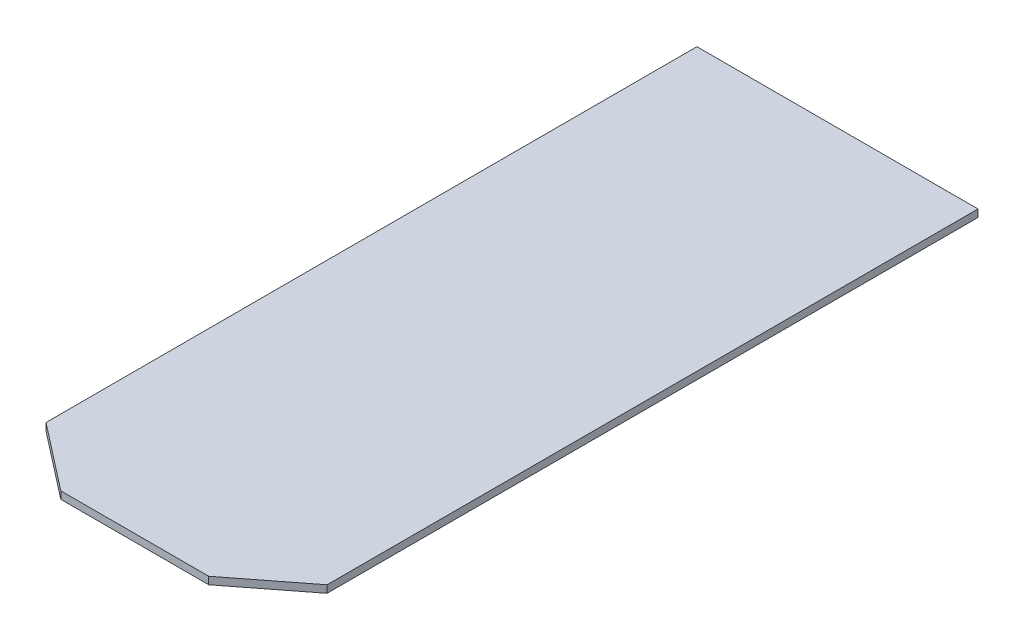
ISO-10303-21;
HEADER;
FILE_DESCRIPTION(('STEP AP214'),'2;1');
FILE_NAME('part.step','',(''),(''),'','','');
FILE_SCHEMA(('AUTOMOTIVE_DESIGN { 1 0 10303 214 1 1 1 1 }'));
ENDSEC;
DATA;
#1=APPLICATION_CONTEXT('core data for automotive mechanical design processes');
#2=APPLICATION_PROTOCOL_DEFINITION('international standard','automotive_design',2000,#1);
#3=PRODUCT_CONTEXT('',#1,'mechanical');
#4=PRODUCT('Part','Part','',(#3));
#5=PRODUCT_RELATED_PRODUCT_CATEGORY('part','',(#4));
#6=PRODUCT_DEFINITION_FORMATION('','',#4);
#7=PRODUCT_DEFINITION_CONTEXT('part definition',#1,'design');
#8=PRODUCT_DEFINITION('design','',#6,#7);
#9=PRODUCT_DEFINITION_SHAPE('','',#8);
#10=(LENGTH_UNIT() NAMED_UNIT(*) SI_UNIT(.MILLI.,.METRE.));
#11=(NAMED_UNIT(*) PLANE_ANGLE_UNIT() SI_UNIT($,.RADIAN.));
#12=(NAMED_UNIT(*) SI_UNIT($,.STERADIAN.) SOLID_ANGLE_UNIT());
#13=UNCERTAINTY_MEASURE_WITH_UNIT(LENGTH_MEASURE(1.E-05),#10,'distance_accuracy_value','');
#14=(GEOMETRIC_REPRESENTATION_CONTEXT(3) GLOBAL_UNCERTAINTY_ASSIGNED_CONTEXT((#13)) GLOBAL_UNIT_ASSIGNED_CONTEXT((#10,
#11,#12)) REPRESENTATION_CONTEXT('',''));
#15=CARTESIAN_POINT('',(0.,0.,0.));
#16=DIRECTION('',(0.,0.,1.));
#17=DIRECTION('',(1.,0.,0.));
#18=AXIS2_PLACEMENT_3D('',#15,#16,#17);
#19=CARTESIAN_POINT('',(19.,1.,-47.5));
#20=DIRECTION('',(-1.,0.,0.));
#21=DIRECTION('',(0.,0.,1.));
#22=AXIS2_PLACEMENT_3D('',#19,#20,#21);
#23=PLANE('',#22);
#24=DIRECTION('',(0.,0.,-1.));
#25=VECTOR('',#24,1.);
#26=CARTESIAN_POINT('',(19.,0.,-47.5));
#27=LINE('',#26,#25);
#28=CARTESIAN_POINT('',(19.,0.,40.5));
#29=VERTEX_POINT('',#28);
#30=CARTESIAN_POINT('',(19.,0.,-47.5));
#31=VERTEX_POINT('',#30);
#32=EDGE_CURVE('E117',#29,#31,#27,.T.);
#33=ORIENTED_EDGE('',*,*,#32,.T.);
#34=DIRECTION('',(0.,-1.,0.));
#35=VECTOR('',#34,1.);
#36=CARTESIAN_POINT('',(19.,1.,-47.5));
#37=LINE('',#36,#35);
#38=CARTESIAN_POINT('',(19.,1.,-47.5));
#39=VERTEX_POINT('',#38);
#40=EDGE_CURVE('E11',#39,#31,#37,.T.);
#41=ORIENTED_EDGE('',*,*,#40,.F.);
#42=DIRECTION('',(0.,0.,-1.));
#43=VECTOR('',#42,1.);
#44=CARTESIAN_POINT('',(19.,1.,-47.5));
#45=LINE('',#44,#43);
#46=CARTESIAN_POINT('',(19.,1.,40.5));
#47=VERTEX_POINT('',#46);
#48=EDGE_CURVE('E127',#47,#39,#45,.T.);
#49=ORIENTED_EDGE('',*,*,#48,.F.);
#50=DIRECTION('',(0.,-1.,0.));
#51=VECTOR('',#50,1.);
#52=CARTESIAN_POINT('',(19.,1.,40.5));
#53=LINE('',#52,#51);
#54=EDGE_CURVE('E113',#47,#29,#53,.T.);
#55=ORIENTED_EDGE('',*,*,#54,.T.);
#56=EDGE_LOOP('',(#33,#41,#49,#55));
#57=FACE_BOUND('',#56,.T.);
#58=ADVANCED_FACE('F33',(#57),#23,.F.);
#59=CARTESIAN_POINT('',(19.,1.,-47.5));
#60=DIRECTION('',(0.,0.,1.));
#61=DIRECTION('',(1.,0.,0.));
#62=AXIS2_PLACEMENT_3D('',#59,#60,#61);
#63=PLANE('',#62);
#64=DIRECTION('',(-1.,0.,0.));
#65=VECTOR('',#64,1.);
#66=CARTESIAN_POINT('',(19.,0.,-47.5));
#67=LINE('',#66,#65);
#68=CARTESIAN_POINT('',(-19.,0.,-47.5));
#69=VERTEX_POINT('',#68);
#70=EDGE_CURVE('E120',#31,#69,#67,.T.);
#71=ORIENTED_EDGE('',*,*,#70,.T.);
#72=DIRECTION('',(0.,-1.,0.));
#73=VECTOR('',#72,1.);
#74=CARTESIAN_POINT('',(-19.,1.,-47.5));
#75=LINE('',#74,#73);
#76=CARTESIAN_POINT('',(-19.,1.,-47.5));
#77=VERTEX_POINT('',#76);
#78=EDGE_CURVE('E41',#77,#69,#75,.T.);
#79=ORIENTED_EDGE('',*,*,#78,.F.);
#80=DIRECTION('',(-1.,0.,0.));
#81=VECTOR('',#80,1.);
#82=CARTESIAN_POINT('',(19.,1.,-47.5));
#83=LINE('',#82,#81);
#84=EDGE_CURVE('E86',#39,#77,#83,.T.);
#85=ORIENTED_EDGE('',*,*,#84,.F.);
#86=ORIENTED_EDGE('',*,*,#40,.T.);
#87=EDGE_LOOP('',(#71,#79,#85,#86));
#88=FACE_BOUND('',#87,.T.);
#89=ADVANCED_FACE('F151',(#88),#63,.F.);
#90=CARTESIAN_POINT('',(-19.,1.,-47.5));
#91=DIRECTION('',(1.,0.,0.));
#92=DIRECTION('',(0.,0.,-1.));
#93=AXIS2_PLACEMENT_3D('',#90,#91,#92);
#94=PLANE('',#93);
#95=DIRECTION('',(0.,0.,1.));
#96=VECTOR('',#95,1.);
#97=CARTESIAN_POINT('',(-19.,0.,-47.5));
#98=LINE('',#97,#96);
#99=CARTESIAN_POINT('',(-19.,0.,40.5));
#100=VERTEX_POINT('',#99);
#101=EDGE_CURVE('E122',#69,#100,#98,.T.);
#102=ORIENTED_EDGE('',*,*,#101,.T.);
#103=DIRECTION('',(0.,-1.,0.));
#104=VECTOR('',#103,1.);
#105=CARTESIAN_POINT('',(-19.,1.,40.5));
#106=LINE('',#105,#104);
#107=CARTESIAN_POINT('',(-19.,1.,40.5));
#108=VERTEX_POINT('',#107);
#109=EDGE_CURVE('E108',#108,#100,#106,.T.);
#110=ORIENTED_EDGE('',*,*,#109,.F.);
#111=DIRECTION('',(0.,0.,1.));
#112=VECTOR('',#111,1.);
#113=CARTESIAN_POINT('',(-19.,1.,-47.5));
#114=LINE('',#113,#112);
#115=EDGE_CURVE('E99',#77,#108,#114,.T.);
#116=ORIENTED_EDGE('',*,*,#115,.F.);
#117=ORIENTED_EDGE('',*,*,#78,.T.);
#118=EDGE_LOOP('',(#102,#110,#116,#117));
#119=FACE_BOUND('',#118,.T.);
#120=ADVANCED_FACE('F133',(#119),#94,.F.);
#121=CARTESIAN_POINT('',(-19.,1.,40.5));
#122=DIRECTION('',(0.613940613514921,0.,-0.789352217376326));
#123=DIRECTION('',(-0.789352217376326,0.,-0.613940613514921));
#124=AXIS2_PLACEMENT_3D('',#121,#122,#123);
#125=PLANE('',#124);
#126=DIRECTION('',(0.789352217376326,0.,0.613940613514921));
#127=VECTOR('',#126,1.);
#128=CARTESIAN_POINT('',(-19.,0.,40.5));
#129=LINE('',#128,#127);
#130=CARTESIAN_POINT('',(-10.,0.,47.5));
#131=VERTEX_POINT('',#130);
#132=EDGE_CURVE('E107',#100,#131,#129,.T.);
#133=ORIENTED_EDGE('',*,*,#132,.T.);
#134=DIRECTION('',(0.,-1.,0.));
#135=VECTOR('',#134,1.);
#136=CARTESIAN_POINT('',(-10.,1.,47.5));
#137=LINE('',#136,#135);
#138=CARTESIAN_POINT('',(-10.,1.,47.5));
#139=VERTEX_POINT('',#138);
#140=EDGE_CURVE('E104',#139,#131,#137,.T.);
#141=ORIENTED_EDGE('',*,*,#140,.F.);
#142=DIRECTION('',(0.789352217376326,0.,0.613940613514921));
#143=VECTOR('',#142,1.);
#144=CARTESIAN_POINT('',(-19.,1.,40.5));
#145=LINE('',#144,#143);
#146=EDGE_CURVE('E93',#108,#139,#145,.T.);
#147=ORIENTED_EDGE('',*,*,#146,.F.);
#148=ORIENTED_EDGE('',*,*,#109,.T.);
#149=EDGE_LOOP('',(#133,#141,#147,#148));
#150=FACE_BOUND('',#149,.T.);
#151=ADVANCED_FACE('F105',(#150),#125,.F.);
#152=CARTESIAN_POINT('',(10.,1.,47.5));
#153=DIRECTION('',(0.,0.,-1.));
#154=DIRECTION('',(-1.,0.,0.));
#155=AXIS2_PLACEMENT_3D('',#152,#153,#154);
#156=PLANE('',#155);
#157=DIRECTION('',(1.,0.,0.));
#158=VECTOR('',#157,1.);
#159=CARTESIAN_POINT('',(10.,0.,47.5));
#160=LINE('',#159,#158);
#161=CARTESIAN_POINT('',(10.,0.,47.5));
#162=VERTEX_POINT('',#161);
#163=EDGE_CURVE('E72',#131,#162,#160,.T.);
#164=ORIENTED_EDGE('',*,*,#163,.T.);
#165=DIRECTION('',(0.,-1.,0.));
#166=VECTOR('',#165,1.);
#167=CARTESIAN_POINT('',(10.,1.,47.5));
#168=LINE('',#167,#166);
#169=CARTESIAN_POINT('',(10.,1.,47.5));
#170=VERTEX_POINT('',#169);
#171=EDGE_CURVE('E109',#170,#162,#168,.T.);
#172=ORIENTED_EDGE('',*,*,#171,.F.);
#173=DIRECTION('',(1.,0.,0.));
#174=VECTOR('',#173,1.);
#175=CARTESIAN_POINT('',(10.,1.,47.5));
#176=LINE('',#175,#174);
#177=EDGE_CURVE('E97',#139,#170,#176,.T.);
#178=ORIENTED_EDGE('',*,*,#177,.F.);
#179=ORIENTED_EDGE('',*,*,#140,.T.);
#180=EDGE_LOOP('',(#164,#172,#178,#179));
#181=FACE_BOUND('',#180,.T.);
#182=ADVANCED_FACE('F111',(#181),#156,.F.);
#183=CARTESIAN_POINT('',(10.,1.,47.5));
#184=DIRECTION('',(-0.613940613514921,0.,-0.789352217376326));
#185=DIRECTION('',(-0.789352217376326,0.,0.613940613514921));
#186=AXIS2_PLACEMENT_3D('',#183,#184,#185);
#187=PLANE('',#186);
#188=DIRECTION('',(0.789352217376326,0.,-0.613940613514921));
#189=VECTOR('',#188,1.);
#190=CARTESIAN_POINT('',(10.,0.,47.5));
#191=LINE('',#190,#189);
#192=EDGE_CURVE('E78',#162,#29,#191,.T.);
#193=ORIENTED_EDGE('',*,*,#192,.T.);
#194=ORIENTED_EDGE('',*,*,#54,.F.);
#195=DIRECTION('',(0.789352217376326,0.,-0.613940613514921));
#196=VECTOR('',#195,1.);
#197=CARTESIAN_POINT('',(10.,1.,47.5));
#198=LINE('',#197,#196);
#199=EDGE_CURVE('E49',#170,#47,#198,.T.);
#200=ORIENTED_EDGE('',*,*,#199,.F.);
#201=ORIENTED_EDGE('',*,*,#171,.T.);
#202=EDGE_LOOP('',(#193,#194,#200,#201));
#203=FACE_BOUND('',#202,.T.);
#204=ADVANCED_FACE('F140',(#203),#187,.F.);
#205=CARTESIAN_POINT('',(0.,1.,0.));
#206=DIRECTION('',(0.,-1.,0.));
#207=DIRECTION('',(0.,0.,-1.));
#208=AXIS2_PLACEMENT_3D('',#205,#206,#207);
#209=PLANE('',#208);
#210=ORIENTED_EDGE('',*,*,#48,.T.);
#211=ORIENTED_EDGE('',*,*,#84,.T.);
#212=ORIENTED_EDGE('',*,*,#115,.T.);
#213=ORIENTED_EDGE('',*,*,#146,.T.);
#214=ORIENTED_EDGE('',*,*,#177,.T.);
#215=ORIENTED_EDGE('',*,*,#199,.T.);
#216=EDGE_LOOP('',(#210,#211,#212,#213,#214,#215));
#217=FACE_BOUND('',#216,.T.);
#218=ADVANCED_FACE('F95',(#217),#209,.F.);
#219=CARTESIAN_POINT('',(0.,0.,0.));
#220=DIRECTION('',(0.,-1.,0.));
#221=DIRECTION('',(0.,0.,-1.));
#222=AXIS2_PLACEMENT_3D('',#219,#220,#221);
#223=PLANE('',#222);
#224=ORIENTED_EDGE('',*,*,#32,.F.);
#225=ORIENTED_EDGE('',*,*,#192,.F.);
#226=ORIENTED_EDGE('',*,*,#163,.F.);
#227=ORIENTED_EDGE('',*,*,#132,.F.);
#228=ORIENTED_EDGE('',*,*,#101,.F.);
#229=ORIENTED_EDGE('',*,*,#70,.F.);
#230=EDGE_LOOP('',(#224,#225,#226,#227,#228,#229));
#231=FACE_BOUND('',#230,.T.);
#232=ADVANCED_FACE('F136',(#231),#223,.T.);
#233=CLOSED_SHELL('',(#58,#89,#120,#151,#182,#204,#218,#232));
#234=MANIFOLD_SOLID_BREP('B2',#233);
#235=ADVANCED_BREP_SHAPE_REPRESENTATION('',(#18,#234),#14);
#236=SHAPE_DEFINITION_REPRESENTATION(#9,#235);
ENDSEC;
END-ISO-10303-21;
